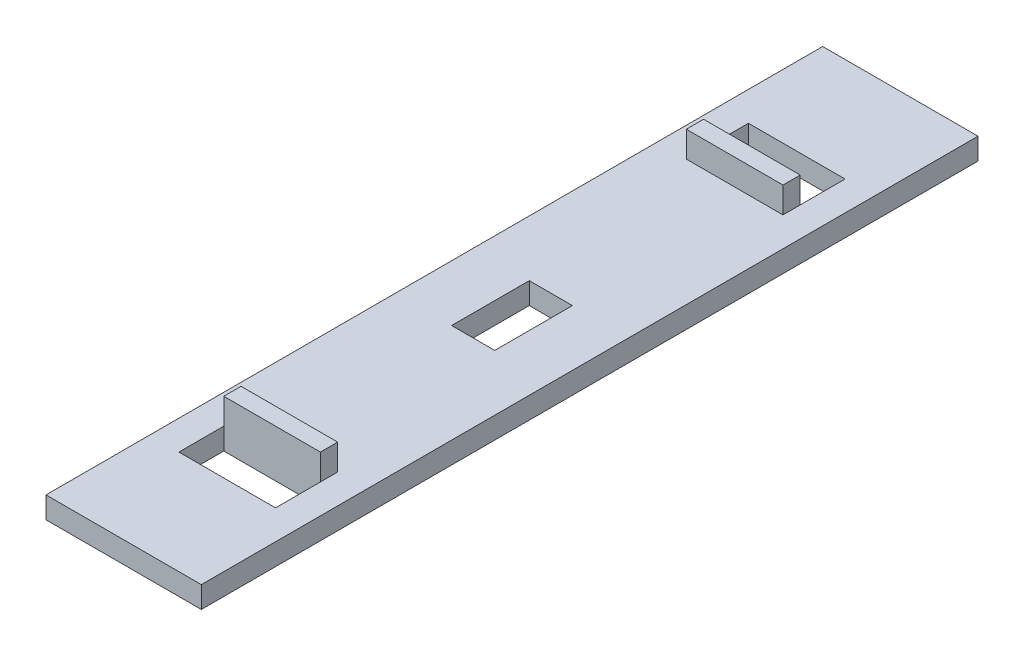
ISO-10303-21;
HEADER;
FILE_DESCRIPTION(('STEP AP214'),'2;1');
FILE_NAME('part.step','',(''),(''),'','','');
FILE_SCHEMA(('AUTOMOTIVE_DESIGN { 1 0 10303 214 1 1 1 1 }'));
ENDSEC;
DATA;
#1=APPLICATION_CONTEXT('core data for automotive mechanical design processes');
#2=APPLICATION_PROTOCOL_DEFINITION('international standard','automotive_design',2000,#1);
#3=PRODUCT_CONTEXT('',#1,'mechanical');
#4=PRODUCT('Part','Part','',(#3));
#5=PRODUCT_RELATED_PRODUCT_CATEGORY('part','',(#4));
#6=PRODUCT_DEFINITION_FORMATION('','',#4);
#7=PRODUCT_DEFINITION_CONTEXT('part definition',#1,'design');
#8=PRODUCT_DEFINITION('design','',#6,#7);
#9=PRODUCT_DEFINITION_SHAPE('','',#8);
#10=(LENGTH_UNIT() NAMED_UNIT(*) SI_UNIT(.MILLI.,.METRE.));
#11=(NAMED_UNIT(*) PLANE_ANGLE_UNIT() SI_UNIT($,.RADIAN.));
#12=(NAMED_UNIT(*) SI_UNIT($,.STERADIAN.) SOLID_ANGLE_UNIT());
#13=UNCERTAINTY_MEASURE_WITH_UNIT(LENGTH_MEASURE(1.E-05),#10,'distance_accuracy_value','');
#14=(GEOMETRIC_REPRESENTATION_CONTEXT(3) GLOBAL_UNCERTAINTY_ASSIGNED_CONTEXT((#13)) GLOBAL_UNIT_ASSIGNED_CONTEXT((#10,
#11,#12)) REPRESENTATION_CONTEXT('',''));
#15=CARTESIAN_POINT('',(0.,0.,0.));
#16=DIRECTION('',(0.,0.,1.));
#17=DIRECTION('',(1.,0.,0.));
#18=AXIS2_PLACEMENT_3D('',#15,#16,#17);
#19=CARTESIAN_POINT('',(0.,1.25,0.));
#20=DIRECTION('',(0.,1.,0.));
#21=DIRECTION('',(0.,0.,1.));
#22=AXIS2_PLACEMENT_3D('',#19,#20,#21);
#23=PLANE('',#22);
#24=DIRECTION('',(0.,0.,1.));
#25=VECTOR('',#24,1.);
#26=CARTESIAN_POINT('',(0.608982135900724,1.25,-6.72251655629139));
#27=LINE('',#26,#25);
#28=CARTESIAN_POINT('',(0.608982135900724,1.25,-7.72251655629139));
#29=VERTEX_POINT('',#28);
#30=CARTESIAN_POINT('',(0.608982135900724,1.25,-6.72251655629139));
#31=VERTEX_POINT('',#30);
#32=EDGE_CURVE('E64',#29,#31,#27,.T.);
#33=ORIENTED_EDGE('',*,*,#32,.F.);
#34=DIRECTION('',(-1.,0.,0.));
#35=VECTOR('',#34,1.);
#36=CARTESIAN_POINT('',(0.608982135900724,1.25,-7.72251655629139));
#37=LINE('',#36,#35);
#38=CARTESIAN_POINT('',(6.20898213590072,1.25,-7.72251655629139));
#39=VERTEX_POINT('',#38);
#40=EDGE_CURVE('E460',#39,#29,#37,.T.);
#41=ORIENTED_EDGE('',*,*,#40,.F.);
#42=DIRECTION('',(0.,0.,-1.));
#43=VECTOR('',#42,1.);
#44=CARTESIAN_POINT('',(6.20898213590072,1.25,-6.72251655629139));
#45=LINE('',#44,#43);
#46=CARTESIAN_POINT('',(6.20898213590072,1.25,-6.72251655629139));
#47=VERTEX_POINT('',#46);
#48=EDGE_CURVE('E353',#47,#39,#45,.T.);
#49=ORIENTED_EDGE('',*,*,#48,.F.);
#50=DIRECTION('',(0.,0.,-1.));
#51=VECTOR('',#50,1.);
#52=CARTESIAN_POINT('',(6.20898213590073,1.25,0.));
#53=LINE('',#52,#51);
#54=CARTESIAN_POINT('',(6.20898213590072,1.25,-4.12251655629139));
#55=VERTEX_POINT('',#54);
#56=EDGE_CURVE('E219',#55,#47,#53,.T.);
#57=ORIENTED_EDGE('',*,*,#56,.F.);
#58=DIRECTION('',(1.,0.,0.));
#59=VECTOR('',#58,1.);
#60=CARTESIAN_POINT('',(0.,1.25,-4.12251655629139));
#61=LINE('',#60,#59);
#62=CARTESIAN_POINT('',(0.608982135900723,1.25,-4.12251655629139));
#63=VERTEX_POINT('',#62);
#64=EDGE_CURVE('E275',#63,#55,#61,.T.);
#65=ORIENTED_EDGE('',*,*,#64,.F.);
#66=DIRECTION('',(0.,0.,-1.));
#67=VECTOR('',#66,1.);
#68=CARTESIAN_POINT('',(0.608982135900722,1.25,0.));
#69=LINE('',#68,#67);
#70=EDGE_CURVE('E278',#63,#31,#69,.T.);
#71=ORIENTED_EDGE('',*,*,#70,.T.);
#72=EDGE_LOOP('',(#33,#41,#49,#57,#65,#71));
#73=FACE_BOUND('',#72,.T.);
#74=DIRECTION('',(0.,0.,1.));
#75=VECTOR('',#74,1.);
#76=CARTESIAN_POINT('',(2.15898213590072,1.25,0.));
#77=LINE('',#76,#75);
#78=CARTESIAN_POINT('',(2.15898213590072,1.25,-22.8725165562914));
#79=VERTEX_POINT('',#78);
#80=CARTESIAN_POINT('',(2.15898213590072,1.25,-18.3725165562914));
#81=VERTEX_POINT('',#80);
#82=EDGE_CURVE('E367',#79,#81,#77,.T.);
#83=ORIENTED_EDGE('',*,*,#82,.F.);
#84=DIRECTION('',(-1.,0.,0.));
#85=VECTOR('',#84,1.);
#86=CARTESIAN_POINT('',(0.,1.25,-22.8725165562914));
#87=LINE('',#86,#85);
#88=CARTESIAN_POINT('',(4.65898213590072,1.25,-22.8725165562914));
#89=VERTEX_POINT('',#88);
#90=EDGE_CURVE('E374',#89,#79,#87,.T.);
#91=ORIENTED_EDGE('',*,*,#90,.F.);
#92=DIRECTION('',(0.,0.,1.));
#93=VECTOR('',#92,1.);
#94=CARTESIAN_POINT('',(4.65898213590072,1.25,0.));
#95=LINE('',#94,#93);
#96=CARTESIAN_POINT('',(4.65898213590072,1.25,-18.3725165562914));
#97=VERTEX_POINT('',#96);
#98=EDGE_CURVE('E258',#89,#97,#95,.T.);
#99=ORIENTED_EDGE('',*,*,#98,.T.);
#100=DIRECTION('',(-1.,0.,0.));
#101=VECTOR('',#100,1.);
#102=CARTESIAN_POINT('',(0.,1.25,-18.3725165562914));
#103=LINE('',#102,#101);
#104=EDGE_CURVE('E377',#97,#81,#103,.T.);
#105=ORIENTED_EDGE('',*,*,#104,.T.);
#106=EDGE_LOOP('',(#83,#91,#99,#105));
#107=FACE_BOUND('',#106,.T.);
#108=DIRECTION('',(0.,0.,1.));
#109=VECTOR('',#108,1.);
#110=CARTESIAN_POINT('',(7.90898213590071,1.25,0.));
#111=LINE('',#110,#109);
#112=CARTESIAN_POINT('',(7.90898213590072,1.25,-43.1225165562914));
#113=VERTEX_POINT('',#112);
#114=CARTESIAN_POINT('',(7.90898213590071,1.25,1.87748344370861));
#115=VERTEX_POINT('',#114);
#116=EDGE_CURVE('E280',#113,#115,#111,.T.);
#117=ORIENTED_EDGE('',*,*,#116,.F.);
#118=DIRECTION('',(1.,0.,0.));
#119=VECTOR('',#118,1.);
#120=CARTESIAN_POINT('',(0.,1.25,-43.1225165562914));
#121=LINE('',#120,#119);
#122=CARTESIAN_POINT('',(-1.09101786409928,1.25,-43.1225165562914));
#123=VERTEX_POINT('',#122);
#124=EDGE_CURVE('E283',#123,#113,#121,.T.);
#125=ORIENTED_EDGE('',*,*,#124,.F.);
#126=DIRECTION('',(0.,0.,1.));
#127=VECTOR('',#126,1.);
#128=CARTESIAN_POINT('',(-1.09101786409928,1.25,0.));
#129=LINE('',#128,#127);
#130=CARTESIAN_POINT('',(-1.09101786409928,1.25,1.87748344370861));
#131=VERTEX_POINT('',#130);
#132=EDGE_CURVE('E286',#123,#131,#129,.T.);
#133=ORIENTED_EDGE('',*,*,#132,.T.);
#134=DIRECTION('',(1.,0.,0.));
#135=VECTOR('',#134,1.);
#136=CARTESIAN_POINT('',(0.,1.25,1.87748344370861));
#137=LINE('',#136,#135);
#138=EDGE_CURVE('E230',#131,#115,#137,.T.);
#139=ORIENTED_EDGE('',*,*,#138,.T.);
#140=EDGE_LOOP('',(#117,#125,#133,#139));
#141=FACE_BOUND('',#140,.T.);
#142=DIRECTION('',(1.,0.,0.));
#143=VECTOR('',#142,1.);
#144=CARTESIAN_POINT('',(0.608982135900724,1.25,-33.5225165562914));
#145=LINE('',#144,#143);
#146=CARTESIAN_POINT('',(0.608982135900724,1.25,-33.5225165562914));
#147=VERTEX_POINT('',#146);
#148=CARTESIAN_POINT('',(6.20898213590072,1.25,-33.5225165562914));
#149=VERTEX_POINT('',#148);
#150=EDGE_CURVE('E198',#147,#149,#145,.T.);
#151=ORIENTED_EDGE('',*,*,#150,.F.);
#152=DIRECTION('',(0.,0.,1.));
#153=VECTOR('',#152,1.);
#154=CARTESIAN_POINT('',(0.608982135900724,1.25,-34.5225165562914));
#155=LINE('',#154,#153);
#156=CARTESIAN_POINT('',(0.608982135900724,1.25,-34.5225165562914));
#157=VERTEX_POINT('',#156);
#158=EDGE_CURVE('E442',#157,#147,#155,.T.);
#159=ORIENTED_EDGE('',*,*,#158,.F.);
#160=DIRECTION('',(0.,0.,1.));
#161=VECTOR('',#160,1.);
#162=CARTESIAN_POINT('',(0.608982135900735,1.25,0.));
#163=LINE('',#162,#161);
#164=CARTESIAN_POINT('',(0.608982135900723,1.25,-37.1225165562914));
#165=VERTEX_POINT('',#164);
#166=EDGE_CURVE('E268',#165,#157,#163,.T.);
#167=ORIENTED_EDGE('',*,*,#166,.F.);
#168=DIRECTION('',(1.,0.,0.));
#169=VECTOR('',#168,1.);
#170=CARTESIAN_POINT('',(0.,1.25,-37.1225165562914));
#171=LINE('',#170,#169);
#172=CARTESIAN_POINT('',(6.20898213590072,1.25,-37.1225165562914));
#173=VERTEX_POINT('',#172);
#174=EDGE_CURVE('E215',#165,#173,#171,.T.);
#175=ORIENTED_EDGE('',*,*,#174,.T.);
#176=DIRECTION('',(0.,0.,1.));
#177=VECTOR('',#176,1.);
#178=CARTESIAN_POINT('',(6.20898213590071,1.25,0.));
#179=LINE('',#178,#177);
#180=CARTESIAN_POINT('',(6.20898213590072,1.25,-34.5225165562914));
#181=VERTEX_POINT('',#180);
#182=EDGE_CURVE('E212',#173,#181,#179,.T.);
#183=ORIENTED_EDGE('',*,*,#182,.T.);
#184=DIRECTION('',(0.,0.,-1.));
#185=VECTOR('',#184,1.);
#186=CARTESIAN_POINT('',(6.20898213590072,1.25,-34.5225165562914));
#187=LINE('',#186,#185);
#188=EDGE_CURVE('E190',#149,#181,#187,.T.);
#189=ORIENTED_EDGE('',*,*,#188,.F.);
#190=EDGE_LOOP('',(#151,#159,#167,#175,#183,#189));
#191=FACE_BOUND('',#190,.T.);
#192=ADVANCED_FACE('F41',(#73,#107,#141,#191),#23,.T.);
#193=CARTESIAN_POINT('',(7.90898213590071,1.25,0.));
#194=DIRECTION('',(1.,0.,0.));
#195=DIRECTION('',(0.,0.,-1.));
#196=AXIS2_PLACEMENT_3D('',#193,#194,#195);
#197=PLANE('',#196);
#198=DIRECTION('',(0.,0.,1.));
#199=VECTOR('',#198,1.);
#200=CARTESIAN_POINT('',(7.90898213590071,0.,0.));
#201=LINE('',#200,#199);
#202=CARTESIAN_POINT('',(7.90898213590072,0.,-43.1225165562914));
#203=VERTEX_POINT('',#202);
#204=CARTESIAN_POINT('',(7.90898213590071,0.,1.87748344370861));
#205=VERTEX_POINT('',#204);
#206=EDGE_CURVE('E309',#203,#205,#201,.T.);
#207=ORIENTED_EDGE('',*,*,#206,.F.);
#208=DIRECTION('',(0.,-1.,0.));
#209=VECTOR('',#208,1.);
#210=CARTESIAN_POINT('',(7.90898213590072,1.25,-43.1225165562914));
#211=LINE('',#210,#209);
#212=EDGE_CURVE('E239',#113,#203,#211,.T.);
#213=ORIENTED_EDGE('',*,*,#212,.F.);
#214=ORIENTED_EDGE('',*,*,#116,.T.);
#215=DIRECTION('',(0.,-1.,0.));
#216=VECTOR('',#215,1.);
#217=CARTESIAN_POINT('',(7.90898213590071,1.25,1.87748344370861));
#218=LINE('',#217,#216);
#219=EDGE_CURVE('E320',#115,#205,#218,.T.);
#220=ORIENTED_EDGE('',*,*,#219,.T.);
#221=EDGE_LOOP('',(#207,#213,#214,#220));
#222=FACE_BOUND('',#221,.T.);
#223=ADVANCED_FACE('F399',(#222),#197,.T.);
#224=CARTESIAN_POINT('',(0.,1.25,-43.1225165562914));
#225=DIRECTION('',(0.,0.,-1.));
#226=DIRECTION('',(-1.,0.,0.));
#227=AXIS2_PLACEMENT_3D('',#224,#225,#226);
#228=PLANE('',#227);
#229=DIRECTION('',(1.,0.,0.));
#230=VECTOR('',#229,1.);
#231=CARTESIAN_POINT('',(0.,0.,-43.1225165562914));
#232=LINE('',#231,#230);
#233=CARTESIAN_POINT('',(-1.09101786409928,0.,-43.1225165562914));
#234=VERTEX_POINT('',#233);
#235=EDGE_CURVE('E312',#234,#203,#232,.T.);
#236=ORIENTED_EDGE('',*,*,#235,.F.);
#237=DIRECTION('',(0.,-1.,0.));
#238=VECTOR('',#237,1.);
#239=CARTESIAN_POINT('',(-1.09101786409928,1.25,-43.1225165562914));
#240=LINE('',#239,#238);
#241=EDGE_CURVE('E326',#123,#234,#240,.T.);
#242=ORIENTED_EDGE('',*,*,#241,.F.);
#243=ORIENTED_EDGE('',*,*,#124,.T.);
#244=ORIENTED_EDGE('',*,*,#212,.T.);
#245=EDGE_LOOP('',(#236,#242,#243,#244));
#246=FACE_BOUND('',#245,.T.);
#247=ADVANCED_FACE('F405',(#246),#228,.T.);
#248=CARTESIAN_POINT('',(-1.09101786409928,1.25,0.));
#249=DIRECTION('',(1.,0.,0.));
#250=DIRECTION('',(0.,0.,-1.));
#251=AXIS2_PLACEMENT_3D('',#248,#249,#250);
#252=PLANE('',#251);
#253=DIRECTION('',(0.,0.,1.));
#254=VECTOR('',#253,1.);
#255=CARTESIAN_POINT('',(-1.09101786409928,0.,0.));
#256=LINE('',#255,#254);
#257=CARTESIAN_POINT('',(-1.09101786409928,0.,1.87748344370861));
#258=VERTEX_POINT('',#257);
#259=EDGE_CURVE('E315',#234,#258,#256,.T.);
#260=ORIENTED_EDGE('',*,*,#259,.T.);
#261=DIRECTION('',(0.,-1.,0.));
#262=VECTOR('',#261,1.);
#263=CARTESIAN_POINT('',(-1.09101786409928,1.25,1.87748344370861));
#264=LINE('',#263,#262);
#265=EDGE_CURVE('E322',#131,#258,#264,.T.);
#266=ORIENTED_EDGE('',*,*,#265,.F.);
#267=ORIENTED_EDGE('',*,*,#132,.F.);
#268=ORIENTED_EDGE('',*,*,#241,.T.);
#269=EDGE_LOOP('',(#260,#266,#267,#268));
#270=FACE_BOUND('',#269,.T.);
#271=ADVANCED_FACE('F412',(#270),#252,.F.);
#272=CARTESIAN_POINT('',(6.20898213590073,1.25,0.));
#273=DIRECTION('',(-1.,0.,0.));
#274=DIRECTION('',(0.,0.,1.));
#275=AXIS2_PLACEMENT_3D('',#272,#273,#274);
#276=PLANE('',#275);
#277=DIRECTION('',(0.,0.,-1.));
#278=VECTOR('',#277,1.);
#279=CARTESIAN_POINT('',(6.20898213590073,0.,0.));
#280=LINE('',#279,#278);
#281=CARTESIAN_POINT('',(6.20898213590072,0.,-4.12251655629139));
#282=VERTEX_POINT('',#281);
#283=CARTESIAN_POINT('',(6.20898213590072,0.,-6.72251655629139));
#284=VERTEX_POINT('',#283);
#285=EDGE_CURVE('E297',#282,#284,#280,.T.);
#286=ORIENTED_EDGE('',*,*,#285,.F.);
#287=DIRECTION('',(0.,-1.,0.));
#288=VECTOR('',#287,1.);
#289=CARTESIAN_POINT('',(6.20898213590072,1.25,-4.12251655629139));
#290=LINE('',#289,#288);
#291=EDGE_CURVE('E323',#55,#282,#290,.T.);
#292=ORIENTED_EDGE('',*,*,#291,.F.);
#293=ORIENTED_EDGE('',*,*,#56,.T.);
#294=DIRECTION('',(0.,-1.,0.));
#295=VECTOR('',#294,1.);
#296=CARTESIAN_POINT('',(6.20898213590072,1.25,-6.72251655629139));
#297=LINE('',#296,#295);
#298=EDGE_CURVE('E235',#47,#284,#297,.T.);
#299=ORIENTED_EDGE('',*,*,#298,.T.);
#300=EDGE_LOOP('',(#286,#292,#293,#299));
#301=FACE_BOUND('',#300,.T.);
#302=ADVANCED_FACE('F341',(#301),#276,.T.);
#303=CARTESIAN_POINT('',(0.,1.25,-4.12251655629139));
#304=DIRECTION('',(0.,0.,-1.));
#305=DIRECTION('',(-1.,0.,0.));
#306=AXIS2_PLACEMENT_3D('',#303,#304,#305);
#307=PLANE('',#306);
#308=DIRECTION('',(1.,0.,0.));
#309=VECTOR('',#308,1.);
#310=CARTESIAN_POINT('',(0.,0.,-4.12251655629139));
#311=LINE('',#310,#309);
#312=CARTESIAN_POINT('',(0.608982135900723,0.,-4.12251655629139));
#313=VERTEX_POINT('',#312);
#314=EDGE_CURVE('E300',#313,#282,#311,.T.);
#315=ORIENTED_EDGE('',*,*,#314,.F.);
#316=DIRECTION('',(0.,-1.,0.));
#317=VECTOR('',#316,1.);
#318=CARTESIAN_POINT('',(0.608982135900723,1.25,-4.12251655629139));
#319=LINE('',#318,#317);
#320=EDGE_CURVE('E333',#63,#313,#319,.T.);
#321=ORIENTED_EDGE('',*,*,#320,.F.);
#322=ORIENTED_EDGE('',*,*,#64,.T.);
#323=ORIENTED_EDGE('',*,*,#291,.T.);
#324=EDGE_LOOP('',(#315,#321,#322,#323));
#325=FACE_BOUND('',#324,.T.);
#326=ADVANCED_FACE('F337',(#325),#307,.T.);
#327=CARTESIAN_POINT('',(0.608982135900722,1.25,0.));
#328=DIRECTION('',(-1.,0.,0.));
#329=DIRECTION('',(0.,0.,1.));
#330=AXIS2_PLACEMENT_3D('',#327,#328,#329);
#331=PLANE('',#330);
#332=DIRECTION('',(0.,0.,-1.));
#333=VECTOR('',#332,1.);
#334=CARTESIAN_POINT('',(0.608982135900722,0.,0.));
#335=LINE('',#334,#333);
#336=CARTESIAN_POINT('',(0.608982135900724,0.,-6.72251655629139));
#337=VERTEX_POINT('',#336);
#338=EDGE_CURVE('E303',#313,#337,#335,.T.);
#339=ORIENTED_EDGE('',*,*,#338,.T.);
#340=DIRECTION('',(0.,-1.,0.));
#341=VECTOR('',#340,1.);
#342=CARTESIAN_POINT('',(0.608982135900724,1.25,-6.72251655629139));
#343=LINE('',#342,#341);
#344=EDGE_CURVE('E330',#31,#337,#343,.T.);
#345=ORIENTED_EDGE('',*,*,#344,.F.);
#346=ORIENTED_EDGE('',*,*,#70,.F.);
#347=ORIENTED_EDGE('',*,*,#320,.T.);
#348=EDGE_LOOP('',(#339,#345,#346,#347));
#349=FACE_BOUND('',#348,.T.);
#350=ADVANCED_FACE('F348',(#349),#331,.F.);
#351=CARTESIAN_POINT('',(0.608982135900735,1.25,0.));
#352=DIRECTION('',(1.,0.,0.));
#353=DIRECTION('',(0.,0.,-1.));
#354=AXIS2_PLACEMENT_3D('',#351,#352,#353);
#355=PLANE('',#354);
#356=DIRECTION('',(0.,0.,1.));
#357=VECTOR('',#356,1.);
#358=CARTESIAN_POINT('',(0.608982135900735,0.,0.));
#359=LINE('',#358,#357);
#360=CARTESIAN_POINT('',(0.608982135900723,0.,-37.1225165562914));
#361=VERTEX_POINT('',#360);
#362=CARTESIAN_POINT('',(0.608982135900724,0.,-34.5225165562914));
#363=VERTEX_POINT('',#362);
#364=EDGE_CURVE('E262',#361,#363,#359,.T.);
#365=ORIENTED_EDGE('',*,*,#364,.F.);
#366=DIRECTION('',(0.,-1.,0.));
#367=VECTOR('',#366,1.);
#368=CARTESIAN_POINT('',(0.608982135900723,1.25,-37.1225165562914));
#369=LINE('',#368,#367);
#370=EDGE_CURVE('E228',#165,#361,#369,.T.);
#371=ORIENTED_EDGE('',*,*,#370,.F.);
#372=ORIENTED_EDGE('',*,*,#166,.T.);
#373=DIRECTION('',(0.,-1.,0.));
#374=VECTOR('',#373,1.);
#375=CARTESIAN_POINT('',(0.608982135900724,1.25,-34.5225165562914));
#376=LINE('',#375,#374);
#377=EDGE_CURVE('E226',#157,#363,#376,.T.);
#378=ORIENTED_EDGE('',*,*,#377,.T.);
#379=EDGE_LOOP('',(#365,#371,#372,#378));
#380=FACE_BOUND('',#379,.T.);
#381=ADVANCED_FACE('F43',(#380),#355,.T.);
#382=CARTESIAN_POINT('',(0.,1.25,-37.1225165562914));
#383=DIRECTION('',(0.,0.,-1.));
#384=DIRECTION('',(-1.,0.,0.));
#385=AXIS2_PLACEMENT_3D('',#382,#383,#384);
#386=PLANE('',#385);
#387=DIRECTION('',(1.,0.,0.));
#388=VECTOR('',#387,1.);
#389=CARTESIAN_POINT('',(0.,0.,-37.1225165562914));
#390=LINE('',#389,#388);
#391=CARTESIAN_POINT('',(6.20898213590072,0.,-37.1225165562914));
#392=VERTEX_POINT('',#391);
#393=EDGE_CURVE('E292',#361,#392,#390,.T.);
#394=ORIENTED_EDGE('',*,*,#393,.T.);
#395=DIRECTION('',(0.,-1.,0.));
#396=VECTOR('',#395,1.);
#397=CARTESIAN_POINT('',(6.20898213590072,1.25,-37.1225165562914));
#398=LINE('',#397,#396);
#399=EDGE_CURVE('E225',#173,#392,#398,.T.);
#400=ORIENTED_EDGE('',*,*,#399,.F.);
#401=ORIENTED_EDGE('',*,*,#174,.F.);
#402=ORIENTED_EDGE('',*,*,#370,.T.);
#403=EDGE_LOOP('',(#394,#400,#401,#402));
#404=FACE_BOUND('',#403,.T.);
#405=ADVANCED_FACE('F430',(#404),#386,.F.);
#406=CARTESIAN_POINT('',(6.20898213590071,1.25,0.));
#407=DIRECTION('',(1.,0.,0.));
#408=DIRECTION('',(0.,0.,-1.));
#409=AXIS2_PLACEMENT_3D('',#406,#407,#408);
#410=PLANE('',#409);
#411=DIRECTION('',(0.,0.,1.));
#412=VECTOR('',#411,1.);
#413=CARTESIAN_POINT('',(6.20898213590071,0.,0.));
#414=LINE('',#413,#412);
#415=CARTESIAN_POINT('',(6.20898213590072,0.,-34.5225165562914));
#416=VERTEX_POINT('',#415);
#417=EDGE_CURVE('E223',#392,#416,#414,.T.);
#418=ORIENTED_EDGE('',*,*,#417,.T.);
#419=DIRECTION('',(0.,-1.,0.));
#420=VECTOR('',#419,1.);
#421=CARTESIAN_POINT('',(6.20898213590072,1.25,-34.5225165562914));
#422=LINE('',#421,#420);
#423=EDGE_CURVE('E205',#181,#416,#422,.T.);
#424=ORIENTED_EDGE('',*,*,#423,.F.);
#425=ORIENTED_EDGE('',*,*,#182,.F.);
#426=ORIENTED_EDGE('',*,*,#399,.T.);
#427=EDGE_LOOP('',(#418,#424,#425,#426));
#428=FACE_BOUND('',#427,.T.);
#429=ADVANCED_FACE('F221',(#428),#410,.F.);
#430=CARTESIAN_POINT('',(0.,1.25,-6.72251655629139));
#431=DIRECTION('',(0.,0.,-1.));
#432=DIRECTION('',(-1.,0.,0.));
#433=AXIS2_PLACEMENT_3D('',#430,#431,#432);
#434=PLANE('',#433);
#435=DIRECTION('',(1.,0.,0.));
#436=VECTOR('',#435,1.);
#437=CARTESIAN_POINT('',(0.,0.,-6.72251655629139));
#438=LINE('',#437,#436);
#439=EDGE_CURVE('E306',#337,#284,#438,.T.);
#440=ORIENTED_EDGE('',*,*,#439,.T.);
#441=ORIENTED_EDGE('',*,*,#298,.F.);
#442=DIRECTION('',(0.,-1.,0.));
#443=VECTOR('',#442,1.);
#444=CARTESIAN_POINT('',(6.20898213590072,2.75,-6.72251655629139));
#445=LINE('',#444,#443);
#446=CARTESIAN_POINT('',(6.20898213590072,2.75,-6.72251655629139));
#447=VERTEX_POINT('',#446);
#448=EDGE_CURVE('E358',#447,#47,#445,.T.);
#449=ORIENTED_EDGE('',*,*,#448,.F.);
#450=DIRECTION('',(1.,0.,0.));
#451=VECTOR('',#450,1.);
#452=CARTESIAN_POINT('',(0.608982135900724,2.75,-6.72251655629139));
#453=LINE('',#452,#451);
#454=CARTESIAN_POINT('',(0.608982135900724,2.75,-6.72251655629139));
#455=VERTEX_POINT('',#454);
#456=EDGE_CURVE('E459',#455,#447,#453,.T.);
#457=ORIENTED_EDGE('',*,*,#456,.F.);
#458=DIRECTION('',(0.,-1.,0.));
#459=VECTOR('',#458,1.);
#460=CARTESIAN_POINT('',(0.608982135900724,2.75,-6.72251655629139));
#461=LINE('',#460,#459);
#462=EDGE_CURVE('E364',#455,#31,#461,.T.);
#463=ORIENTED_EDGE('',*,*,#462,.T.);
#464=ORIENTED_EDGE('',*,*,#344,.T.);
#465=EDGE_LOOP('',(#440,#441,#449,#457,#463,#464));
#466=FACE_BOUND('',#465,.T.);
#467=ADVANCED_FACE('F419',(#466),#434,.F.);
#468=CARTESIAN_POINT('',(0.,1.25,-34.5225165562914));
#469=DIRECTION('',(0.,0.,-1.));
#470=DIRECTION('',(-1.,0.,0.));
#471=AXIS2_PLACEMENT_3D('',#468,#469,#470);
#472=PLANE('',#471);
#473=DIRECTION('',(1.,0.,0.));
#474=VECTOR('',#473,1.);
#475=CARTESIAN_POINT('',(0.,0.,-34.5225165562914));
#476=LINE('',#475,#474);
#477=EDGE_CURVE('E295',#363,#416,#476,.T.);
#478=ORIENTED_EDGE('',*,*,#477,.F.);
#479=ORIENTED_EDGE('',*,*,#377,.F.);
#480=DIRECTION('',(0.,-1.,0.));
#481=VECTOR('',#480,1.);
#482=CARTESIAN_POINT('',(0.608982135900724,2.75,-34.5225165562914));
#483=LINE('',#482,#481);
#484=CARTESIAN_POINT('',(0.608982135900724,2.75,-34.5225165562914));
#485=VERTEX_POINT('',#484);
#486=EDGE_CURVE('E440',#485,#157,#483,.T.);
#487=ORIENTED_EDGE('',*,*,#486,.F.);
#488=DIRECTION('',(-1.,0.,0.));
#489=VECTOR('',#488,1.);
#490=CARTESIAN_POINT('',(0.608982135900724,2.75,-34.5225165562914));
#491=LINE('',#490,#489);
#492=CARTESIAN_POINT('',(6.20898213590072,2.75,-34.5225165562914));
#493=VERTEX_POINT('',#492);
#494=EDGE_CURVE('E199',#493,#485,#491,.T.);
#495=ORIENTED_EDGE('',*,*,#494,.F.);
#496=DIRECTION('',(0.,-1.,0.));
#497=VECTOR('',#496,1.);
#498=CARTESIAN_POINT('',(6.20898213590072,2.75,-34.5225165562914));
#499=LINE('',#498,#497);
#500=EDGE_CURVE('E193',#493,#181,#499,.T.);
#501=ORIENTED_EDGE('',*,*,#500,.T.);
#502=ORIENTED_EDGE('',*,*,#423,.T.);
#503=EDGE_LOOP('',(#478,#479,#487,#495,#501,#502));
#504=FACE_BOUND('',#503,.T.);
#505=ADVANCED_FACE('F203',(#504),#472,.T.);
#506=CARTESIAN_POINT('',(0.,1.25,1.87748344370861));
#507=DIRECTION('',(0.,0.,-1.));
#508=DIRECTION('',(-1.,0.,0.));
#509=AXIS2_PLACEMENT_3D('',#506,#507,#508);
#510=PLANE('',#509);
#511=DIRECTION('',(1.,0.,0.));
#512=VECTOR('',#511,1.);
#513=CARTESIAN_POINT('',(0.,0.,1.87748344370861));
#514=LINE('',#513,#512);
#515=EDGE_CURVE('E271',#258,#205,#514,.T.);
#516=ORIENTED_EDGE('',*,*,#515,.T.);
#517=ORIENTED_EDGE('',*,*,#219,.F.);
#518=ORIENTED_EDGE('',*,*,#138,.F.);
#519=ORIENTED_EDGE('',*,*,#265,.T.);
#520=EDGE_LOOP('',(#516,#517,#518,#519));
#521=FACE_BOUND('',#520,.T.);
#522=ADVANCED_FACE('F395',(#521),#510,.F.);
#523=CARTESIAN_POINT('',(0.,0.,0.));
#524=DIRECTION('',(0.,1.,0.));
#525=DIRECTION('',(0.,0.,1.));
#526=AXIS2_PLACEMENT_3D('',#523,#524,#525);
#527=PLANE('',#526);
#528=DIRECTION('',(-1.,0.,0.));
#529=VECTOR('',#528,1.);
#530=CARTESIAN_POINT('',(0.,0.,-22.8725165562914));
#531=LINE('',#530,#529);
#532=CARTESIAN_POINT('',(4.65898213590072,0.,-22.8725165562914));
#533=VERTEX_POINT('',#532);
#534=CARTESIAN_POINT('',(2.15898213590072,0.,-22.8725165562914));
#535=VERTEX_POINT('',#534);
#536=EDGE_CURVE('E49',#533,#535,#531,.T.);
#537=ORIENTED_EDGE('',*,*,#536,.T.);
#538=DIRECTION('',(0.,0.,1.));
#539=VECTOR('',#538,1.);
#540=CARTESIAN_POINT('',(2.15898213590072,0.,0.));
#541=LINE('',#540,#539);
#542=CARTESIAN_POINT('',(2.15898213590072,0.,-18.3725165562914));
#543=VERTEX_POINT('',#542);
#544=EDGE_CURVE('E11',#535,#543,#541,.T.);
#545=ORIENTED_EDGE('',*,*,#544,.T.);
#546=DIRECTION('',(-1.,0.,0.));
#547=VECTOR('',#546,1.);
#548=CARTESIAN_POINT('',(0.,0.,-18.3725165562914));
#549=LINE('',#548,#547);
#550=CARTESIAN_POINT('',(4.65898213590072,0.,-18.3725165562914));
#551=VERTEX_POINT('',#550);
#552=EDGE_CURVE('E236',#551,#543,#549,.T.);
#553=ORIENTED_EDGE('',*,*,#552,.F.);
#554=DIRECTION('',(0.,0.,1.));
#555=VECTOR('',#554,1.);
#556=CARTESIAN_POINT('',(4.65898213590072,0.,0.));
#557=LINE('',#556,#555);
#558=EDGE_CURVE('E238',#533,#551,#557,.T.);
#559=ORIENTED_EDGE('',*,*,#558,.F.);
#560=EDGE_LOOP('',(#537,#545,#553,#559));
#561=FACE_BOUND('',#560,.T.);
#562=ORIENTED_EDGE('',*,*,#364,.T.);
#563=ORIENTED_EDGE('',*,*,#477,.T.);
#564=ORIENTED_EDGE('',*,*,#417,.F.);
#565=ORIENTED_EDGE('',*,*,#393,.F.);
#566=EDGE_LOOP('',(#562,#563,#564,#565));
#567=FACE_BOUND('',#566,.T.);
#568=ORIENTED_EDGE('',*,*,#285,.T.);
#569=ORIENTED_EDGE('',*,*,#439,.F.);
#570=ORIENTED_EDGE('',*,*,#338,.F.);
#571=ORIENTED_EDGE('',*,*,#314,.T.);
#572=EDGE_LOOP('',(#568,#569,#570,#571));
#573=FACE_BOUND('',#572,.T.);
#574=ORIENTED_EDGE('',*,*,#206,.T.);
#575=ORIENTED_EDGE('',*,*,#515,.F.);
#576=ORIENTED_EDGE('',*,*,#259,.F.);
#577=ORIENTED_EDGE('',*,*,#235,.T.);
#578=EDGE_LOOP('',(#574,#575,#576,#577));
#579=FACE_BOUND('',#578,.T.);
#580=ADVANCED_FACE('F244',(#561,#567,#573,#579),#527,.F.);
#581=CARTESIAN_POINT('',(2.15898213590072,-1.2E-05,0.));
#582=DIRECTION('',(-1.,0.,0.));
#583=DIRECTION('',(0.,0.,1.));
#584=AXIS2_PLACEMENT_3D('',#581,#582,#583);
#585=PLANE('',#584);
#586=DIRECTION('',(0.,1.,0.));
#587=VECTOR('',#586,1.);
#588=CARTESIAN_POINT('',(2.15898213590072,-1.2E-05,-22.8725165562914));
#589=LINE('',#588,#587);
#590=EDGE_CURVE('E254',#535,#79,#589,.T.);
#591=ORIENTED_EDGE('',*,*,#590,.T.);
#592=ORIENTED_EDGE('',*,*,#82,.T.);
#593=DIRECTION('',(0.,1.,0.));
#594=VECTOR('',#593,1.);
#595=CARTESIAN_POINT('',(2.15898213590072,-1.2E-05,-18.3725165562914));
#596=LINE('',#595,#594);
#597=EDGE_CURVE('E264',#543,#81,#596,.T.);
#598=ORIENTED_EDGE('',*,*,#597,.F.);
#599=ORIENTED_EDGE('',*,*,#544,.F.);
#600=EDGE_LOOP('',(#591,#592,#598,#599));
#601=FACE_BOUND('',#600,.T.);
#602=ADVANCED_FACE('F387',(#601),#585,.F.);
#603=CARTESIAN_POINT('',(0.,-1.2E-05,-22.8725165562914));
#604=DIRECTION('',(0.,0.,-1.));
#605=DIRECTION('',(-1.,0.,0.));
#606=AXIS2_PLACEMENT_3D('',#603,#604,#605);
#607=PLANE('',#606);
#608=DIRECTION('',(0.,1.,0.));
#609=VECTOR('',#608,1.);
#610=CARTESIAN_POINT('',(4.65898213590072,-1.2E-05,-22.8725165562914));
#611=LINE('',#610,#609);
#612=EDGE_CURVE('E252',#533,#89,#611,.T.);
#613=ORIENTED_EDGE('',*,*,#612,.T.);
#614=ORIENTED_EDGE('',*,*,#90,.T.);
#615=ORIENTED_EDGE('',*,*,#590,.F.);
#616=ORIENTED_EDGE('',*,*,#536,.F.);
#617=EDGE_LOOP('',(#613,#614,#615,#616));
#618=FACE_BOUND('',#617,.T.);
#619=ADVANCED_FACE('F250',(#618),#607,.F.);
#620=CARTESIAN_POINT('',(4.65898213590072,-1.2E-05,0.));
#621=DIRECTION('',(-1.,0.,0.));
#622=DIRECTION('',(0.,0.,1.));
#623=AXIS2_PLACEMENT_3D('',#620,#621,#622);
#624=PLANE('',#623);
#625=ORIENTED_EDGE('',*,*,#558,.T.);
#626=DIRECTION('',(0.,1.,0.));
#627=VECTOR('',#626,1.);
#628=CARTESIAN_POINT('',(4.65898213590072,-1.2E-05,-18.3725165562914));
#629=LINE('',#628,#627);
#630=EDGE_CURVE('E260',#551,#97,#629,.T.);
#631=ORIENTED_EDGE('',*,*,#630,.T.);
#632=ORIENTED_EDGE('',*,*,#98,.F.);
#633=ORIENTED_EDGE('',*,*,#612,.F.);
#634=EDGE_LOOP('',(#625,#631,#632,#633));
#635=FACE_BOUND('',#634,.T.);
#636=ADVANCED_FACE('F256',(#635),#624,.T.);
#637=CARTESIAN_POINT('',(0.,-1.2E-05,-18.3725165562914));
#638=DIRECTION('',(0.,0.,-1.));
#639=DIRECTION('',(-1.,0.,0.));
#640=AXIS2_PLACEMENT_3D('',#637,#638,#639);
#641=PLANE('',#640);
#642=ORIENTED_EDGE('',*,*,#552,.T.);
#643=ORIENTED_EDGE('',*,*,#597,.T.);
#644=ORIENTED_EDGE('',*,*,#104,.F.);
#645=ORIENTED_EDGE('',*,*,#630,.F.);
#646=EDGE_LOOP('',(#642,#643,#644,#645));
#647=FACE_BOUND('',#646,.T.);
#648=ADVANCED_FACE('F383',(#647),#641,.T.);
#649=CARTESIAN_POINT('',(0.608982135900724,2.75,-6.72251655629139));
#650=DIRECTION('',(1.,0.,0.));
#651=DIRECTION('',(0.,0.,-1.));
#652=AXIS2_PLACEMENT_3D('',#649,#650,#651);
#653=PLANE('',#652);
#654=ORIENTED_EDGE('',*,*,#32,.T.);
#655=ORIENTED_EDGE('',*,*,#462,.F.);
#656=DIRECTION('',(0.,0.,1.));
#657=VECTOR('',#656,1.);
#658=CARTESIAN_POINT('',(0.608982135900724,2.75,-6.72251655629139));
#659=LINE('',#658,#657);
#660=CARTESIAN_POINT('',(0.608982135900724,2.75,-7.72251655629139));
#661=VERTEX_POINT('',#660);
#662=EDGE_CURVE('E456',#661,#455,#659,.T.);
#663=ORIENTED_EDGE('',*,*,#662,.F.);
#664=DIRECTION('',(0.,-1.,0.));
#665=VECTOR('',#664,1.);
#666=CARTESIAN_POINT('',(0.608982135900724,2.75,-7.72251655629139));
#667=LINE('',#666,#665);
#668=EDGE_CURVE('E369',#661,#29,#667,.T.);
#669=ORIENTED_EDGE('',*,*,#668,.T.);
#670=EDGE_LOOP('',(#654,#655,#663,#669));
#671=FACE_BOUND('',#670,.T.);
#672=ADVANCED_FACE('F470',(#671),#653,.F.);
#673=CARTESIAN_POINT('',(6.20898213590072,2.75,-6.72251655629139));
#674=DIRECTION('',(-1.,0.,0.));
#675=DIRECTION('',(0.,0.,1.));
#676=AXIS2_PLACEMENT_3D('',#673,#674,#675);
#677=PLANE('',#676);
#678=ORIENTED_EDGE('',*,*,#48,.T.);
#679=DIRECTION('',(0.,-1.,0.));
#680=VECTOR('',#679,1.);
#681=CARTESIAN_POINT('',(6.20898213590072,2.75,-7.72251655629139));
#682=LINE('',#681,#680);
#683=CARTESIAN_POINT('',(6.20898213590072,2.75,-7.72251655629139));
#684=VERTEX_POINT('',#683);
#685=EDGE_CURVE('E365',#684,#39,#682,.T.);
#686=ORIENTED_EDGE('',*,*,#685,.F.);
#687=DIRECTION('',(0.,0.,-1.));
#688=VECTOR('',#687,1.);
#689=CARTESIAN_POINT('',(6.20898213590072,2.75,-6.72251655629139));
#690=LINE('',#689,#688);
#691=EDGE_CURVE('E362',#447,#684,#690,.T.);
#692=ORIENTED_EDGE('',*,*,#691,.F.);
#693=ORIENTED_EDGE('',*,*,#448,.T.);
#694=EDGE_LOOP('',(#678,#686,#692,#693));
#695=FACE_BOUND('',#694,.T.);
#696=ADVANCED_FACE('F359',(#695),#677,.F.);
#697=CARTESIAN_POINT('',(0.608982135900724,2.75,-7.72251655629139));
#698=DIRECTION('',(0.,0.,1.));
#699=DIRECTION('',(1.,0.,0.));
#700=AXIS2_PLACEMENT_3D('',#697,#698,#699);
#701=PLANE('',#700);
#702=ORIENTED_EDGE('',*,*,#40,.T.);
#703=ORIENTED_EDGE('',*,*,#668,.F.);
#704=DIRECTION('',(-1.,0.,0.));
#705=VECTOR('',#704,1.);
#706=CARTESIAN_POINT('',(0.608982135900724,2.75,-7.72251655629139));
#707=LINE('',#706,#705);
#708=EDGE_CURVE('E463',#684,#661,#707,.T.);
#709=ORIENTED_EDGE('',*,*,#708,.F.);
#710=ORIENTED_EDGE('',*,*,#685,.T.);
#711=EDGE_LOOP('',(#702,#703,#709,#710));
#712=FACE_BOUND('',#711,.T.);
#713=ADVANCED_FACE('F474',(#712),#701,.F.);
#714=CARTESIAN_POINT('',(0.,2.75,0.));
#715=DIRECTION('',(0.,-1.,0.));
#716=DIRECTION('',(0.,0.,-1.));
#717=AXIS2_PLACEMENT_3D('',#714,#715,#716);
#718=PLANE('',#717);
#719=ORIENTED_EDGE('',*,*,#662,.T.);
#720=ORIENTED_EDGE('',*,*,#456,.T.);
#721=ORIENTED_EDGE('',*,*,#691,.T.);
#722=ORIENTED_EDGE('',*,*,#708,.T.);
#723=EDGE_LOOP('',(#719,#720,#721,#722));
#724=FACE_BOUND('',#723,.T.);
#725=ADVANCED_FACE('F476',(#724),#718,.F.);
#726=CARTESIAN_POINT('',(0.608982135900724,2.75,-34.5225165562914));
#727=DIRECTION('',(1.,0.,0.));
#728=DIRECTION('',(0.,0.,-1.));
#729=AXIS2_PLACEMENT_3D('',#726,#727,#728);
#730=PLANE('',#729);
#731=ORIENTED_EDGE('',*,*,#158,.T.);
#732=DIRECTION('',(0.,-1.,0.));
#733=VECTOR('',#732,1.);
#734=CARTESIAN_POINT('',(0.608982135900724,2.75,-33.5225165562914));
#735=LINE('',#734,#733);
#736=CARTESIAN_POINT('',(0.608982135900724,2.75,-33.5225165562914));
#737=VERTEX_POINT('',#736);
#738=EDGE_CURVE('E585',#737,#147,#735,.T.);
#739=ORIENTED_EDGE('',*,*,#738,.F.);
#740=DIRECTION('',(0.,0.,1.));
#741=VECTOR('',#740,1.);
#742=CARTESIAN_POINT('',(0.608982135900724,2.75,-34.5225165562914));
#743=LINE('',#742,#741);
#744=EDGE_CURVE('E453',#485,#737,#743,.T.);
#745=ORIENTED_EDGE('',*,*,#744,.F.);
#746=ORIENTED_EDGE('',*,*,#486,.T.);
#747=EDGE_LOOP('',(#731,#739,#745,#746));
#748=FACE_BOUND('',#747,.T.);
#749=ADVANCED_FACE('F478',(#748),#730,.F.);
#750=CARTESIAN_POINT('',(0.608982135900724,2.75,-33.5225165562914));
#751=DIRECTION('',(0.,0.,-1.));
#752=DIRECTION('',(-1.,0.,0.));
#753=AXIS2_PLACEMENT_3D('',#750,#751,#752);
#754=PLANE('',#753);
#755=ORIENTED_EDGE('',*,*,#150,.T.);
#756=DIRECTION('',(0.,-1.,0.));
#757=VECTOR('',#756,1.);
#758=CARTESIAN_POINT('',(6.20898213590072,2.75,-33.5225165562914));
#759=LINE('',#758,#757);
#760=CARTESIAN_POINT('',(6.20898213590072,2.75,-33.5225165562914));
#761=VERTEX_POINT('',#760);
#762=EDGE_CURVE('E56',#761,#149,#759,.T.);
#763=ORIENTED_EDGE('',*,*,#762,.F.);
#764=DIRECTION('',(1.,0.,0.));
#765=VECTOR('',#764,1.);
#766=CARTESIAN_POINT('',(0.608982135900724,2.75,-33.5225165562914));
#767=LINE('',#766,#765);
#768=EDGE_CURVE('E451',#737,#761,#767,.T.);
#769=ORIENTED_EDGE('',*,*,#768,.F.);
#770=ORIENTED_EDGE('',*,*,#738,.T.);
#771=EDGE_LOOP('',(#755,#763,#769,#770));
#772=FACE_BOUND('',#771,.T.);
#773=ADVANCED_FACE('F484',(#772),#754,.F.);
#774=CARTESIAN_POINT('',(6.20898213590072,2.75,-34.5225165562914));
#775=DIRECTION('',(-1.,0.,0.));
#776=DIRECTION('',(0.,0.,1.));
#777=AXIS2_PLACEMENT_3D('',#774,#775,#776);
#778=PLANE('',#777);
#779=ORIENTED_EDGE('',*,*,#188,.T.);
#780=ORIENTED_EDGE('',*,*,#500,.F.);
#781=DIRECTION('',(0.,0.,-1.));
#782=VECTOR('',#781,1.);
#783=CARTESIAN_POINT('',(6.20898213590072,2.75,-34.5225165562914));
#784=LINE('',#783,#782);
#785=EDGE_CURVE('E209',#761,#493,#784,.T.);
#786=ORIENTED_EDGE('',*,*,#785,.F.);
#787=ORIENTED_EDGE('',*,*,#762,.T.);
#788=EDGE_LOOP('',(#779,#780,#786,#787));
#789=FACE_BOUND('',#788,.T.);
#790=ADVANCED_FACE('F192',(#789),#778,.F.);
#791=CARTESIAN_POINT('',(0.,2.75,0.));
#792=DIRECTION('',(0.,-1.,0.));
#793=DIRECTION('',(0.,0.,-1.));
#794=AXIS2_PLACEMENT_3D('',#791,#792,#793);
#795=PLANE('',#794);
#796=ORIENTED_EDGE('',*,*,#494,.T.);
#797=ORIENTED_EDGE('',*,*,#744,.T.);
#798=ORIENTED_EDGE('',*,*,#768,.T.);
#799=ORIENTED_EDGE('',*,*,#785,.T.);
#800=EDGE_LOOP('',(#796,#797,#798,#799));
#801=FACE_BOUND('',#800,.T.);
#802=ADVANCED_FACE('F488',(#801),#795,.F.);
#803=CLOSED_SHELL('',(#192,#223,#247,#271,#302,#326,#350,#381,#405,#429,#467,#505,#522,#580,
#602,#619,#636,#648,#672,#696,#713,#725,#749,#773,#790,#802));
#804=MANIFOLD_SOLID_BREP('B2',#803);
#805=ADVANCED_BREP_SHAPE_REPRESENTATION('',(#18,#804),#14);
#806=SHAPE_DEFINITION_REPRESENTATION(#9,#805);
ENDSEC;
END-ISO-10303-21;
